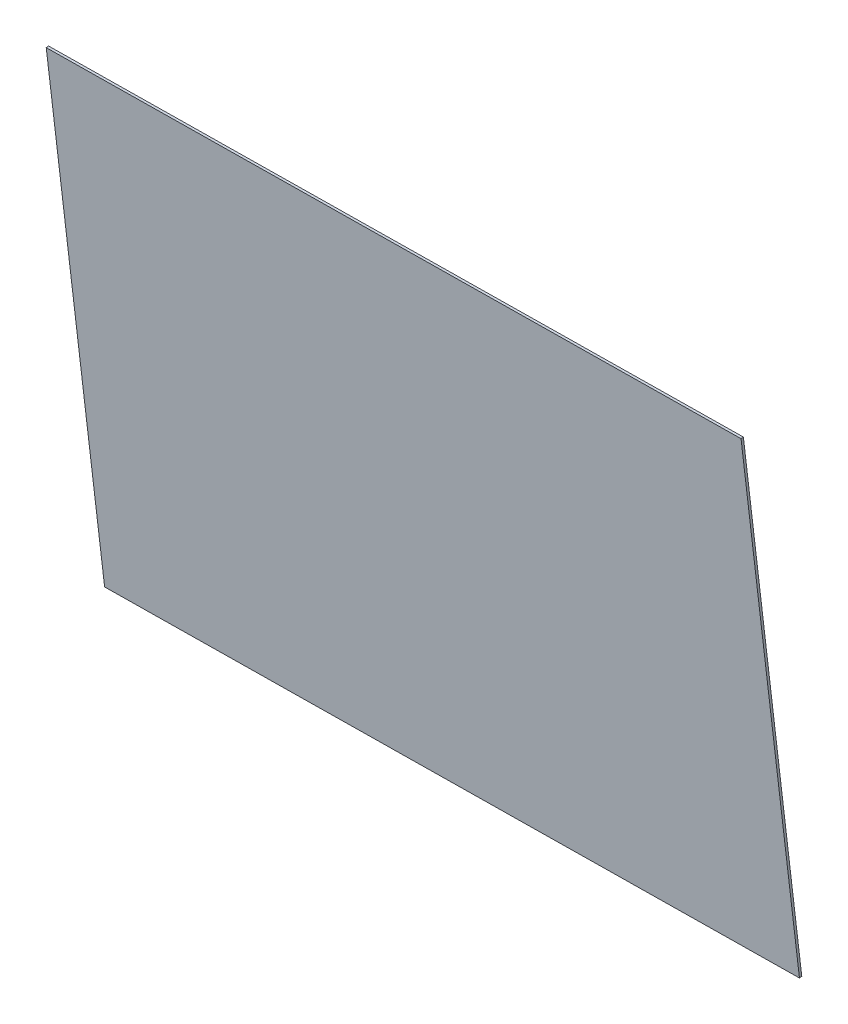
ISO-10303-21;
HEADER;
FILE_DESCRIPTION(('STEP AP214'),'2;1');
FILE_NAME('part.step','',(''),(''),'','','');
FILE_SCHEMA(('AUTOMOTIVE_DESIGN { 1 0 10303 214 1 1 1 1 }'));
ENDSEC;
DATA;
#1=APPLICATION_CONTEXT('core data for automotive mechanical design processes');
#2=APPLICATION_PROTOCOL_DEFINITION('international standard','automotive_design',2000,#1);
#3=PRODUCT_CONTEXT('',#1,'mechanical');
#4=PRODUCT('Part','Part','',(#3));
#5=PRODUCT_RELATED_PRODUCT_CATEGORY('part','',(#4));
#6=PRODUCT_DEFINITION_FORMATION('','',#4);
#7=PRODUCT_DEFINITION_CONTEXT('part definition',#1,'design');
#8=PRODUCT_DEFINITION('design','',#6,#7);
#9=PRODUCT_DEFINITION_SHAPE('','',#8);
#10=(LENGTH_UNIT() NAMED_UNIT(*) SI_UNIT(.MILLI.,.METRE.));
#11=(NAMED_UNIT(*) PLANE_ANGLE_UNIT() SI_UNIT($,.RADIAN.));
#12=(NAMED_UNIT(*) SI_UNIT($,.STERADIAN.) SOLID_ANGLE_UNIT());
#13=UNCERTAINTY_MEASURE_WITH_UNIT(LENGTH_MEASURE(1.E-05),#10,'distance_accuracy_value','');
#14=(GEOMETRIC_REPRESENTATION_CONTEXT(3) GLOBAL_UNCERTAINTY_ASSIGNED_CONTEXT((#13)) GLOBAL_UNIT_ASSIGNED_CONTEXT((#10,
#11,#12)) REPRESENTATION_CONTEXT('',''));
#15=CARTESIAN_POINT('',(0.,0.,0.));
#16=DIRECTION('',(0.,0.,1.));
#17=DIRECTION('',(1.,0.,0.));
#18=AXIS2_PLACEMENT_3D('',#15,#16,#17);
#19=CARTESIAN_POINT('',(131.091798873762,-677.214322715577,-272.181245183921));
#20=DIRECTION('',(0.999899544381668,0.0140963136781481,0.00148158226920704));
#21=DIRECTION('',(-0.0140963291494841,0.999900641816231,0.));
#22=AXIS2_PLACEMENT_3D('',#19,#20,#21);
#23=PLANE('',#22);
#24=DIRECTION('',(0.0141739601147024,-0.994421990056329,-0.104517962796242));
#25=VECTOR('',#24,1.);
#26=CARTESIAN_POINT('',(131.091798873762,-677.109794252309,-273.175767079289));
#27=LINE('',#26,#25);
#28=CARTESIAN_POINT('',(131.091798873762,-677.109794252309,-273.175767079289));
#29=VERTEX_POINT('',#28);
#30=CARTESIAN_POINT('',(134.068330497849,-885.938412164137,-295.1245392665));
#31=VERTEX_POINT('',#30);
#32=EDGE_CURVE('E102',#29,#31,#27,.T.);
#33=ORIENTED_EDGE('',*,*,#32,.T.);
#34=DIRECTION('',(0.,0.104528463267653,-0.994521895368273));
#35=VECTOR('',#34,1.);
#36=CARTESIAN_POINT('',(134.068330497849,-886.042940627405,-294.130017371132));
#37=LINE('',#36,#35);
#38=CARTESIAN_POINT('',(134.068330497849,-886.042940627405,-294.130017371132));
#39=VERTEX_POINT('',#38);
#40=EDGE_CURVE('E11',#39,#31,#37,.T.);
#41=ORIENTED_EDGE('',*,*,#40,.F.);
#42=DIRECTION('',(0.0141739601147024,-0.994421990056329,-0.104517962796242));
#43=VECTOR('',#42,1.);
#44=CARTESIAN_POINT('',(131.091798873762,-677.214322715577,-272.181245183921));
#45=LINE('',#44,#43);
#46=CARTESIAN_POINT('',(131.091798873762,-677.214322715577,-272.181245183921));
#47=VERTEX_POINT('',#46);
#48=EDGE_CURVE('E90',#47,#39,#45,.T.);
#49=ORIENTED_EDGE('',*,*,#48,.F.);
#50=DIRECTION('',(0.,0.104528463267653,-0.994521895368273));
#51=VECTOR('',#50,1.);
#52=CARTESIAN_POINT('',(131.091798873762,-677.214322715577,-272.181245183921));
#53=LINE('',#52,#51);
#54=EDGE_CURVE('E98',#47,#29,#53,.T.);
#55=ORIENTED_EDGE('',*,*,#54,.T.);
#56=EDGE_LOOP('',(#33,#41,#49,#55));
#57=FACE_BOUND('',#56,.T.);
#58=ADVANCED_FACE('F39',(#57),#23,.F.);
#59=CARTESIAN_POINT('',(134.068330497849,-886.042940627405,-294.130017371132));
#60=DIRECTION('',(-0.0141739601147024,0.994421990056329,0.104517962796242));
#61=DIRECTION('',(0.,-0.104528463267653,0.994521895368273));
#62=AXIS2_PLACEMENT_3D('',#59,#60,#61);
#63=PLANE('',#62);
#64=DIRECTION('',(0.999899544381668,0.0140963136781481,0.001481582269207));
#65=VECTOR('',#64,1.);
#66=CARTESIAN_POINT('',(134.068330497849,-885.938412164137,-295.1245392665));
#67=LINE('',#66,#65);
#68=CARTESIAN_POINT('',(431.038495179204,-881.751807001727,-294.684509332546));
#69=VERTEX_POINT('',#68);
#70=EDGE_CURVE('E94',#31,#69,#67,.T.);
#71=ORIENTED_EDGE('',*,*,#70,.T.);
#72=DIRECTION('',(0.,0.104528463267653,-0.994521895368273));
#73=VECTOR('',#72,1.);
#74=CARTESIAN_POINT('',(431.038495179204,-881.856335464995,-293.689987437177));
#75=LINE('',#74,#73);
#76=CARTESIAN_POINT('',(431.038495179204,-881.856335464995,-293.689987437177));
#77=VERTEX_POINT('',#76);
#78=EDGE_CURVE('E47',#77,#69,#75,.T.);
#79=ORIENTED_EDGE('',*,*,#78,.F.);
#80=DIRECTION('',(0.999899544381668,0.0140963136781481,0.001481582269207));
#81=VECTOR('',#80,1.);
#82=CARTESIAN_POINT('',(134.068330497849,-886.042940627405,-294.130017371132));
#83=LINE('',#82,#81);
#84=EDGE_CURVE('E85',#39,#77,#83,.T.);
#85=ORIENTED_EDGE('',*,*,#84,.F.);
#86=ORIENTED_EDGE('',*,*,#40,.T.);
#87=EDGE_LOOP('',(#71,#79,#85,#86));
#88=FACE_BOUND('',#87,.T.);
#89=ADVANCED_FACE('F93',(#88),#63,.F.);
#90=CARTESIAN_POINT('',(428.061963555117,-673.027717553167,-271.741215249967));
#91=DIRECTION('',(-0.999899544381668,-0.0140963136781498,-0.00148158226920722));
#92=DIRECTION('',(0.0140963291494858,-0.99990064181623,0.));
#93=AXIS2_PLACEMENT_3D('',#90,#91,#92);
#94=PLANE('',#93);
#95=DIRECTION('',(-0.0141739601147041,0.994421990056329,0.104517962796242));
#96=VECTOR('',#95,1.);
#97=CARTESIAN_POINT('',(428.061963555117,-672.923189089899,-272.735737145335));
#98=LINE('',#97,#96);
#99=CARTESIAN_POINT('',(428.061963555117,-672.923189089899,-272.735737145335));
#100=VERTEX_POINT('',#99);
#101=EDGE_CURVE('E72',#69,#100,#98,.T.);
#102=ORIENTED_EDGE('',*,*,#101,.T.);
#103=DIRECTION('',(0.,0.104528463267653,-0.994521895368273));
#104=VECTOR('',#103,1.);
#105=CARTESIAN_POINT('',(428.061963555117,-673.027717553167,-271.741215249967));
#106=LINE('',#105,#104);
#107=CARTESIAN_POINT('',(428.061963555117,-673.027717553167,-271.741215249967));
#108=VERTEX_POINT('',#107);
#109=EDGE_CURVE('E95',#108,#100,#106,.T.);
#110=ORIENTED_EDGE('',*,*,#109,.F.);
#111=DIRECTION('',(-0.0141739601147041,0.994421990056329,0.104517962796242));
#112=VECTOR('',#111,1.);
#113=CARTESIAN_POINT('',(428.061963555117,-673.027717553167,-271.741215249967));
#114=LINE('',#113,#112);
#115=EDGE_CURVE('E88',#77,#108,#114,.T.);
#116=ORIENTED_EDGE('',*,*,#115,.F.);
#117=ORIENTED_EDGE('',*,*,#78,.T.);
#118=EDGE_LOOP('',(#102,#110,#116,#117));
#119=FACE_BOUND('',#118,.T.);
#120=ADVANCED_FACE('F96',(#119),#94,.F.);
#121=CARTESIAN_POINT('',(131.091798873762,-677.214322715577,-272.181245183921));
#122=DIRECTION('',(0.0141739601147024,-0.994421990056329,-0.104517962796242));
#123=DIRECTION('',(0.,0.104528463267653,-0.994521895368273));
#124=AXIS2_PLACEMENT_3D('',#121,#122,#123);
#125=PLANE('',#124);
#126=DIRECTION('',(-0.999899544381668,-0.0140963136781481,-0.001481582269207));
#127=VECTOR('',#126,1.);
#128=CARTESIAN_POINT('',(131.091798873762,-677.109794252309,-273.175767079289));
#129=LINE('',#128,#127);
#130=EDGE_CURVE('E78',#100,#29,#129,.T.);
#131=ORIENTED_EDGE('',*,*,#130,.T.);
#132=ORIENTED_EDGE('',*,*,#54,.F.);
#133=DIRECTION('',(-0.999899544381668,-0.0140963136781481,-0.001481582269207));
#134=VECTOR('',#133,1.);
#135=CARTESIAN_POINT('',(131.091798873762,-677.214322715577,-272.181245183921));
#136=LINE('',#135,#134);
#137=EDGE_CURVE('E55',#108,#47,#136,.T.);
#138=ORIENTED_EDGE('',*,*,#137,.F.);
#139=ORIENTED_EDGE('',*,*,#109,.T.);
#140=EDGE_LOOP('',(#131,#132,#138,#139));
#141=FACE_BOUND('',#140,.T.);
#142=ADVANCED_FACE('F109',(#141),#125,.F.);
#143=CARTESIAN_POINT('',(0.,20.895452563153,-198.806951121757));
#144=DIRECTION('',(0.,-0.104528463267653,0.994521895368274));
#145=DIRECTION('',(0.,-0.994521895368274,-0.104528463267653));
#146=AXIS2_PLACEMENT_3D('',#143,#144,#145);
#147=PLANE('',#146);
#148=ORIENTED_EDGE('',*,*,#48,.T.);
#149=ORIENTED_EDGE('',*,*,#84,.T.);
#150=ORIENTED_EDGE('',*,*,#115,.T.);
#151=ORIENTED_EDGE('',*,*,#137,.T.);
#152=EDGE_LOOP('',(#148,#149,#150,#151));
#153=FACE_BOUND('',#152,.T.);
#154=ADVANCED_FACE('F86',(#153),#147,.T.);
#155=CARTESIAN_POINT('',(0.,20.9999810264206,-199.801473017126));
#156=DIRECTION('',(0.,-0.104528463267653,0.994521895368274));
#157=DIRECTION('',(0.,-0.994521895368274,-0.104528463267653));
#158=AXIS2_PLACEMENT_3D('',#155,#156,#157);
#159=PLANE('',#158);
#160=ORIENTED_EDGE('',*,*,#32,.F.);
#161=ORIENTED_EDGE('',*,*,#130,.F.);
#162=ORIENTED_EDGE('',*,*,#101,.F.);
#163=ORIENTED_EDGE('',*,*,#70,.F.);
#164=EDGE_LOOP('',(#160,#161,#162,#163));
#165=FACE_BOUND('',#164,.T.);
#166=ADVANCED_FACE('F112',(#165),#159,.F.);
#167=CLOSED_SHELL('',(#58,#89,#120,#142,#154,#166));
#168=MANIFOLD_SOLID_BREP('B2',#167);
#169=ADVANCED_BREP_SHAPE_REPRESENTATION('',(#18,#168),#14);
#170=SHAPE_DEFINITION_REPRESENTATION(#9,#169);
ENDSEC;
END-ISO-10303-21;
